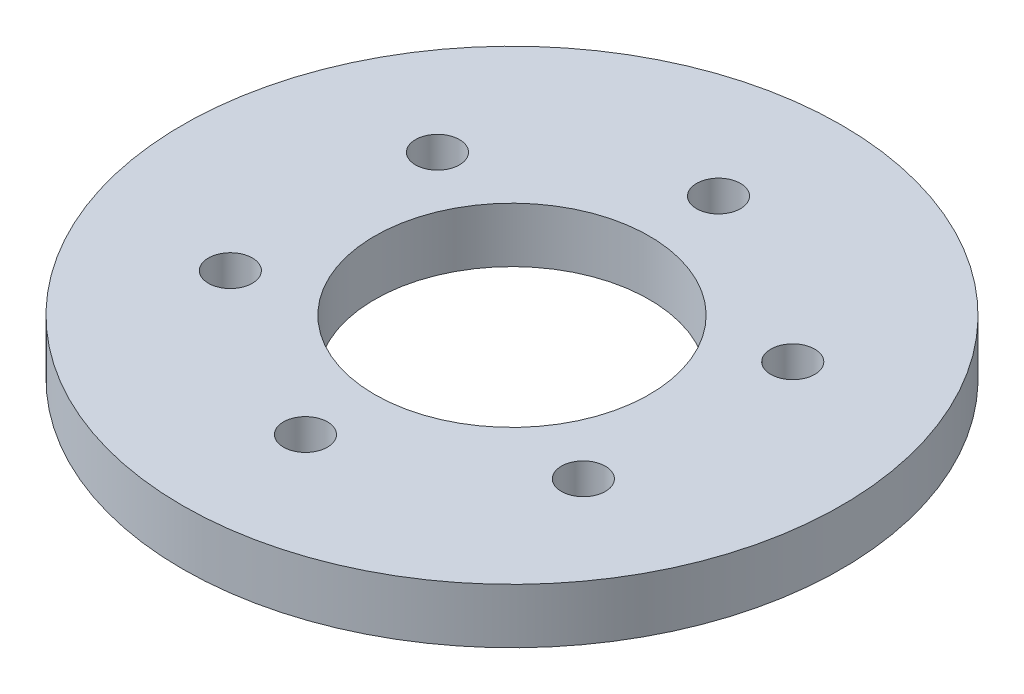
ISO-10303-21;
HEADER;
FILE_DESCRIPTION(('STEP AP214'),'2;1');
FILE_NAME('part.step','',(''),(''),'','','');
FILE_SCHEMA(('AUTOMOTIVE_DESIGN { 1 0 10303 214 1 1 1 1 }'));
ENDSEC;
DATA;
#1=APPLICATION_CONTEXT('core data for automotive mechanical design processes');
#2=APPLICATION_PROTOCOL_DEFINITION('international standard','automotive_design',2000,#1);
#3=PRODUCT_CONTEXT('',#1,'mechanical');
#4=PRODUCT('Part','Part','',(#3));
#5=PRODUCT_RELATED_PRODUCT_CATEGORY('part','',(#4));
#6=PRODUCT_DEFINITION_FORMATION('','',#4);
#7=PRODUCT_DEFINITION_CONTEXT('part definition',#1,'design');
#8=PRODUCT_DEFINITION('design','',#6,#7);
#9=PRODUCT_DEFINITION_SHAPE('','',#8);
#10=(LENGTH_UNIT() NAMED_UNIT(*) SI_UNIT(.MILLI.,.METRE.));
#11=(NAMED_UNIT(*) PLANE_ANGLE_UNIT() SI_UNIT($,.RADIAN.));
#12=(NAMED_UNIT(*) SI_UNIT($,.STERADIAN.) SOLID_ANGLE_UNIT());
#13=UNCERTAINTY_MEASURE_WITH_UNIT(LENGTH_MEASURE(1.E-05),#10,'distance_accuracy_value','');
#14=(GEOMETRIC_REPRESENTATION_CONTEXT(3) GLOBAL_UNCERTAINTY_ASSIGNED_CONTEXT((#13)) GLOBAL_UNIT_ASSIGNED_CONTEXT((#10,
#11,#12)) REPRESENTATION_CONTEXT('',''));
#15=CARTESIAN_POINT('',(0.,0.,0.));
#16=DIRECTION('',(0.,0.,1.));
#17=DIRECTION('',(1.,0.,0.));
#18=AXIS2_PLACEMENT_3D('',#15,#16,#17);
#19=CARTESIAN_POINT('',(0.,6.35,6.34999999999999));
#20=DIRECTION('',(0.,1.,0.));
#21=DIRECTION('',(0.,0.,1.));
#22=AXIS2_PLACEMENT_3D('',#19,#20,#21);
#23=PLANE('',#22);
#24=CARTESIAN_POINT('',(0.,6.35,-17.526));
#25=DIRECTION('',(0.,1.,0.));
#26=DIRECTION('',(0.,0.,1.));
#27=AXIS2_PLACEMENT_3D('',#24,#25,#26);
#28=CIRCLE('',#27,2.54);
#29=CARTESIAN_POINT('',(0.,6.35,-14.986));
#30=VERTEX_POINT('',#29);
#31=EDGE_CURVE('E73',#30,#30,#28,.T.);
#32=ORIENTED_EDGE('',*,*,#31,.F.);
#33=EDGE_LOOP('',(#32));
#34=FACE_BOUND('',#33,.T.);
#35=CARTESIAN_POINT('',(20.8822017407236,6.35,-5.22570846469972));
#36=DIRECTION('',(0.,1.,0.));
#37=DIRECTION('',(0.,0.,1.));
#38=AXIS2_PLACEMENT_3D('',#35,#36,#37);
#39=CIRCLE('',#38,2.54);
#40=CARTESIAN_POINT('',(20.8822017407236,6.35,-2.68570846469971));
#41=VERTEX_POINT('',#40);
#42=EDGE_CURVE('E61',#41,#41,#39,.T.);
#43=ORIENTED_EDGE('',*,*,#42,.F.);
#44=EDGE_LOOP('',(#43));
#45=FACE_BOUND('',#44,.T.);
#46=CARTESIAN_POINT('',(-20.6320309915109,6.35,-5.66593413619315));
#47=DIRECTION('',(0.,1.,0.));
#48=DIRECTION('',(0.,0.,1.));
#49=AXIS2_PLACEMENT_3D('',#46,#47,#48);
#50=CIRCLE('',#49,2.54);
#51=CARTESIAN_POINT('',(-20.6320309915109,6.35,-3.12593413619315));
#52=VERTEX_POINT('',#51);
#53=EDGE_CURVE('E49',#52,#52,#50,.T.);
#54=ORIENTED_EDGE('',*,*,#53,.F.);
#55=EDGE_LOOP('',(#54));
#56=FACE_BOUND('',#55,.T.);
#57=CARTESIAN_POINT('',(0.,6.35,6.34999999999999));
#58=DIRECTION('',(0.,1.,0.));
#59=DIRECTION('',(0.,0.,1.));
#60=AXIS2_PLACEMENT_3D('',#57,#58,#59);
#61=CIRCLE('',#60,38.1);
#62=CARTESIAN_POINT('',(0.,6.35,44.45));
#63=VERTEX_POINT('',#62);
#64=EDGE_CURVE('E10',#63,#63,#61,.T.);
#65=ORIENTED_EDGE('',*,*,#64,.T.);
#66=EDGE_LOOP('',(#65));
#67=FACE_BOUND('',#66,.T.);
#68=CARTESIAN_POINT('',(0.,6.35,6.34999999999999));
#69=DIRECTION('',(0.,1.,0.));
#70=DIRECTION('',(0.,0.,1.));
#71=AXIS2_PLACEMENT_3D('',#68,#69,#70);
#72=CIRCLE('',#71,15.875);
#73=CARTESIAN_POINT('',(0.,6.35,22.225));
#74=VERTEX_POINT('',#73);
#75=EDGE_CURVE('E44',#74,#74,#72,.T.);
#76=ORIENTED_EDGE('',*,*,#75,.F.);
#77=EDGE_LOOP('',(#76));
#78=FACE_BOUND('',#77,.T.);
#79=CARTESIAN_POINT('',(-20.7511843734317,6.35,18.1589679100184));
#80=DIRECTION('',(0.,1.,0.));
#81=DIRECTION('',(0.,0.,1.));
#82=AXIS2_PLACEMENT_3D('',#79,#80,#81);
#83=CIRCLE('',#82,2.54);
#84=CARTESIAN_POINT('',(-20.7511843734317,6.35,20.6989679100184));
#85=VERTEX_POINT('',#84);
#86=EDGE_CURVE('E55',#85,#85,#83,.T.);
#87=ORIENTED_EDGE('',*,*,#86,.F.);
#88=EDGE_LOOP('',(#87));
#89=FACE_BOUND('',#88,.T.);
#90=CARTESIAN_POINT('',(20.4960965781378,6.35,18.5963627685794));
#91=DIRECTION('',(0.,1.,0.));
#92=DIRECTION('',(0.,0.,1.));
#93=AXIS2_PLACEMENT_3D('',#90,#91,#92);
#94=CIRCLE('',#93,2.54);
#95=CARTESIAN_POINT('',(20.4960965781378,6.35,21.1363627685794));
#96=VERTEX_POINT('',#95);
#97=EDGE_CURVE('E67',#96,#96,#94,.T.);
#98=ORIENTED_EDGE('',*,*,#97,.F.);
#99=EDGE_LOOP('',(#98));
#100=FACE_BOUND('',#99,.T.);
#101=CARTESIAN_POINT('',(0.,6.35,30.226));
#102=DIRECTION('',(0.,1.,0.));
#103=DIRECTION('',(0.,0.,-1.));
#104=AXIS2_PLACEMENT_3D('',#101,#102,#103);
#105=CIRCLE('',#104,2.54);
#106=CARTESIAN_POINT('',(0.,6.35,27.686));
#107=VERTEX_POINT('',#106);
#108=EDGE_CURVE('E79',#107,#107,#105,.T.);
#109=ORIENTED_EDGE('',*,*,#108,.F.);
#110=EDGE_LOOP('',(#109));
#111=FACE_BOUND('',#110,.T.);
#112=ADVANCED_FACE('F33',(#34,#45,#56,#67,#78,#89,#100,#111),#23,.T.);
#113=CARTESIAN_POINT('',(0.,0.,6.34999999999999));
#114=DIRECTION('',(0.,1.,0.));
#115=DIRECTION('',(0.,0.,1.));
#116=AXIS2_PLACEMENT_3D('',#113,#114,#115);
#117=PLANE('',#116);
#118=CARTESIAN_POINT('',(0.,0.,6.34999999999999));
#119=DIRECTION('',(0.,1.,0.));
#120=DIRECTION('',(0.,0.,1.));
#121=AXIS2_PLACEMENT_3D('',#118,#119,#120);
#122=CIRCLE('',#121,38.1);
#123=CARTESIAN_POINT('',(0.,0.,44.45));
#124=VERTEX_POINT('',#123);
#125=EDGE_CURVE('E37',#124,#124,#122,.T.);
#126=ORIENTED_EDGE('',*,*,#125,.F.);
#127=EDGE_LOOP('',(#126));
#128=FACE_BOUND('',#127,.T.);
#129=CARTESIAN_POINT('',(0.,0.,6.34999999999999));
#130=DIRECTION('',(0.,1.,0.));
#131=DIRECTION('',(0.,0.,1.));
#132=AXIS2_PLACEMENT_3D('',#129,#130,#131);
#133=CIRCLE('',#132,15.875);
#134=CARTESIAN_POINT('',(0.,0.,22.225));
#135=VERTEX_POINT('',#134);
#136=EDGE_CURVE('E46',#135,#135,#133,.T.);
#137=ORIENTED_EDGE('',*,*,#136,.T.);
#138=EDGE_LOOP('',(#137));
#139=FACE_BOUND('',#138,.T.);
#140=CARTESIAN_POINT('',(-20.6320309915109,0.,-5.66593413619315));
#141=DIRECTION('',(0.,1.,0.));
#142=DIRECTION('',(0.,0.,1.));
#143=AXIS2_PLACEMENT_3D('',#140,#141,#142);
#144=CIRCLE('',#143,2.54);
#145=CARTESIAN_POINT('',(-20.6320309915109,0.,-3.12593413619315));
#146=VERTEX_POINT('',#145);
#147=EDGE_CURVE('E52',#146,#146,#144,.T.);
#148=ORIENTED_EDGE('',*,*,#147,.T.);
#149=EDGE_LOOP('',(#148));
#150=FACE_BOUND('',#149,.T.);
#151=CARTESIAN_POINT('',(-20.7511843734317,0.,18.1589679100184));
#152=DIRECTION('',(0.,1.,0.));
#153=DIRECTION('',(0.,0.,1.));
#154=AXIS2_PLACEMENT_3D('',#151,#152,#153);
#155=CIRCLE('',#154,2.54);
#156=CARTESIAN_POINT('',(-20.7511843734317,0.,20.6989679100184));
#157=VERTEX_POINT('',#156);
#158=EDGE_CURVE('E58',#157,#157,#155,.T.);
#159=ORIENTED_EDGE('',*,*,#158,.T.);
#160=EDGE_LOOP('',(#159));
#161=FACE_BOUND('',#160,.T.);
#162=CARTESIAN_POINT('',(20.8822017407236,0.,-5.22570846469972));
#163=DIRECTION('',(0.,1.,0.));
#164=DIRECTION('',(0.,0.,1.));
#165=AXIS2_PLACEMENT_3D('',#162,#163,#164);
#166=CIRCLE('',#165,2.54);
#167=CARTESIAN_POINT('',(20.8822017407236,0.,-2.68570846469971));
#168=VERTEX_POINT('',#167);
#169=EDGE_CURVE('E64',#168,#168,#166,.T.);
#170=ORIENTED_EDGE('',*,*,#169,.T.);
#171=EDGE_LOOP('',(#170));
#172=FACE_BOUND('',#171,.T.);
#173=CARTESIAN_POINT('',(20.4960965781378,0.,18.5963627685794));
#174=DIRECTION('',(0.,1.,0.));
#175=DIRECTION('',(0.,0.,1.));
#176=AXIS2_PLACEMENT_3D('',#173,#174,#175);
#177=CIRCLE('',#176,2.54);
#178=CARTESIAN_POINT('',(20.4960965781378,0.,21.1363627685794));
#179=VERTEX_POINT('',#178);
#180=EDGE_CURVE('E70',#179,#179,#177,.T.);
#181=ORIENTED_EDGE('',*,*,#180,.T.);
#182=EDGE_LOOP('',(#181));
#183=FACE_BOUND('',#182,.T.);
#184=CARTESIAN_POINT('',(0.,0.,-17.526));
#185=DIRECTION('',(0.,1.,0.));
#186=DIRECTION('',(0.,0.,1.));
#187=AXIS2_PLACEMENT_3D('',#184,#185,#186);
#188=CIRCLE('',#187,2.54);
#189=CARTESIAN_POINT('',(0.,0.,-14.986));
#190=VERTEX_POINT('',#189);
#191=EDGE_CURVE('E76',#190,#190,#188,.T.);
#192=ORIENTED_EDGE('',*,*,#191,.T.);
#193=EDGE_LOOP('',(#192));
#194=FACE_BOUND('',#193,.T.);
#195=CARTESIAN_POINT('',(0.,0.,30.226));
#196=DIRECTION('',(0.,1.,0.));
#197=DIRECTION('',(0.,0.,-1.));
#198=AXIS2_PLACEMENT_3D('',#195,#196,#197);
#199=CIRCLE('',#198,2.54);
#200=CARTESIAN_POINT('',(0.,0.,27.686));
#201=VERTEX_POINT('',#200);
#202=EDGE_CURVE('E82',#201,#201,#199,.T.);
#203=ORIENTED_EDGE('',*,*,#202,.T.);
#204=EDGE_LOOP('',(#203));
#205=FACE_BOUND('',#204,.T.);
#206=ADVANCED_FACE('F92',(#128,#139,#150,#161,#172,#183,#194,#205),#117,.F.);
#207=CARTESIAN_POINT('',(0.,6.35,6.34999999999999));
#208=DIRECTION('',(0.,-1.,0.));
#209=DIRECTION('',(0.,0.,-1.));
#210=AXIS2_PLACEMENT_3D('',#207,#208,#209);
#211=CYLINDRICAL_SURFACE('',#210,38.1);
#212=ORIENTED_EDGE('',*,*,#64,.F.);
#213=EDGE_LOOP('',(#212));
#214=FACE_BOUND('',#213,.T.);
#215=ORIENTED_EDGE('',*,*,#125,.T.);
#216=EDGE_LOOP('',(#215));
#217=FACE_BOUND('',#216,.T.);
#218=ADVANCED_FACE('F35',(#214,#217),#211,.T.);
#219=CARTESIAN_POINT('',(0.,6.35,6.34999999999999));
#220=DIRECTION('',(0.,-1.,0.));
#221=DIRECTION('',(0.,0.,-1.));
#222=AXIS2_PLACEMENT_3D('',#219,#220,#221);
#223=CYLINDRICAL_SURFACE('',#222,15.875);
#224=ORIENTED_EDGE('',*,*,#75,.T.);
#225=EDGE_LOOP('',(#224));
#226=FACE_BOUND('',#225,.T.);
#227=ORIENTED_EDGE('',*,*,#136,.F.);
#228=EDGE_LOOP('',(#227));
#229=FACE_BOUND('',#228,.T.);
#230=ADVANCED_FACE('F102',(#226,#229),#223,.F.);
#231=CARTESIAN_POINT('',(-20.6320309915109,6.35,-5.66593413619315));
#232=DIRECTION('',(0.,-1.,0.));
#233=DIRECTION('',(0.,0.,-1.));
#234=AXIS2_PLACEMENT_3D('',#231,#232,#233);
#235=CYLINDRICAL_SURFACE('',#234,2.54);
#236=ORIENTED_EDGE('',*,*,#53,.T.);
#237=EDGE_LOOP('',(#236));
#238=FACE_BOUND('',#237,.T.);
#239=ORIENTED_EDGE('',*,*,#147,.F.);
#240=EDGE_LOOP('',(#239));
#241=FACE_BOUND('',#240,.T.);
#242=ADVANCED_FACE('F105',(#238,#241),#235,.F.);
#243=CARTESIAN_POINT('',(-20.7511843734317,6.35,18.1589679100184));
#244=DIRECTION('',(0.,-1.,0.));
#245=DIRECTION('',(0.,0.,-1.));
#246=AXIS2_PLACEMENT_3D('',#243,#244,#245);
#247=CYLINDRICAL_SURFACE('',#246,2.54);
#248=ORIENTED_EDGE('',*,*,#86,.T.);
#249=EDGE_LOOP('',(#248));
#250=FACE_BOUND('',#249,.T.);
#251=ORIENTED_EDGE('',*,*,#158,.F.);
#252=EDGE_LOOP('',(#251));
#253=FACE_BOUND('',#252,.T.);
#254=ADVANCED_FACE('F109',(#250,#253),#247,.F.);
#255=CARTESIAN_POINT('',(20.8822017407236,6.35,-5.22570846469972));
#256=DIRECTION('',(0.,-1.,0.));
#257=DIRECTION('',(0.,0.,-1.));
#258=AXIS2_PLACEMENT_3D('',#255,#256,#257);
#259=CYLINDRICAL_SURFACE('',#258,2.54);
#260=ORIENTED_EDGE('',*,*,#42,.T.);
#261=EDGE_LOOP('',(#260));
#262=FACE_BOUND('',#261,.T.);
#263=ORIENTED_EDGE('',*,*,#169,.F.);
#264=EDGE_LOOP('',(#263));
#265=FACE_BOUND('',#264,.T.);
#266=ADVANCED_FACE('F113',(#262,#265),#259,.F.);
#267=CARTESIAN_POINT('',(20.4960965781378,6.35,18.5963627685794));
#268=DIRECTION('',(0.,-1.,0.));
#269=DIRECTION('',(0.,0.,-1.));
#270=AXIS2_PLACEMENT_3D('',#267,#268,#269);
#271=CYLINDRICAL_SURFACE('',#270,2.54);
#272=ORIENTED_EDGE('',*,*,#97,.T.);
#273=EDGE_LOOP('',(#272));
#274=FACE_BOUND('',#273,.T.);
#275=ORIENTED_EDGE('',*,*,#180,.F.);
#276=EDGE_LOOP('',(#275));
#277=FACE_BOUND('',#276,.T.);
#278=ADVANCED_FACE('F117',(#274,#277),#271,.F.);
#279=CARTESIAN_POINT('',(0.,6.35,-17.526));
#280=DIRECTION('',(0.,-1.,0.));
#281=DIRECTION('',(0.,0.,-1.));
#282=AXIS2_PLACEMENT_3D('',#279,#280,#281);
#283=CYLINDRICAL_SURFACE('',#282,2.54);
#284=ORIENTED_EDGE('',*,*,#31,.T.);
#285=EDGE_LOOP('',(#284));
#286=FACE_BOUND('',#285,.T.);
#287=ORIENTED_EDGE('',*,*,#191,.F.);
#288=EDGE_LOOP('',(#287));
#289=FACE_BOUND('',#288,.T.);
#290=ADVANCED_FACE('F121',(#286,#289),#283,.F.);
#291=CARTESIAN_POINT('',(0.,6.35,30.226));
#292=DIRECTION('',(0.,-1.,0.));
#293=DIRECTION('',(0.,0.,-1.));
#294=AXIS2_PLACEMENT_3D('',#291,#292,#293);
#295=CYLINDRICAL_SURFACE('',#294,2.54);
#296=ORIENTED_EDGE('',*,*,#108,.T.);
#297=EDGE_LOOP('',(#296));
#298=FACE_BOUND('',#297,.T.);
#299=ORIENTED_EDGE('',*,*,#202,.F.);
#300=EDGE_LOOP('',(#299));
#301=FACE_BOUND('',#300,.T.);
#302=ADVANCED_FACE('F88',(#298,#301),#295,.F.);
#303=CLOSED_SHELL('',(#112,#206,#218,#230,#242,#254,#266,#278,#290,#302));
#304=MANIFOLD_SOLID_BREP('B2',#303);
#305=ADVANCED_BREP_SHAPE_REPRESENTATION('',(#18,#304),#14);
#306=SHAPE_DEFINITION_REPRESENTATION(#9,#305);
ENDSEC;
END-ISO-10303-21;
